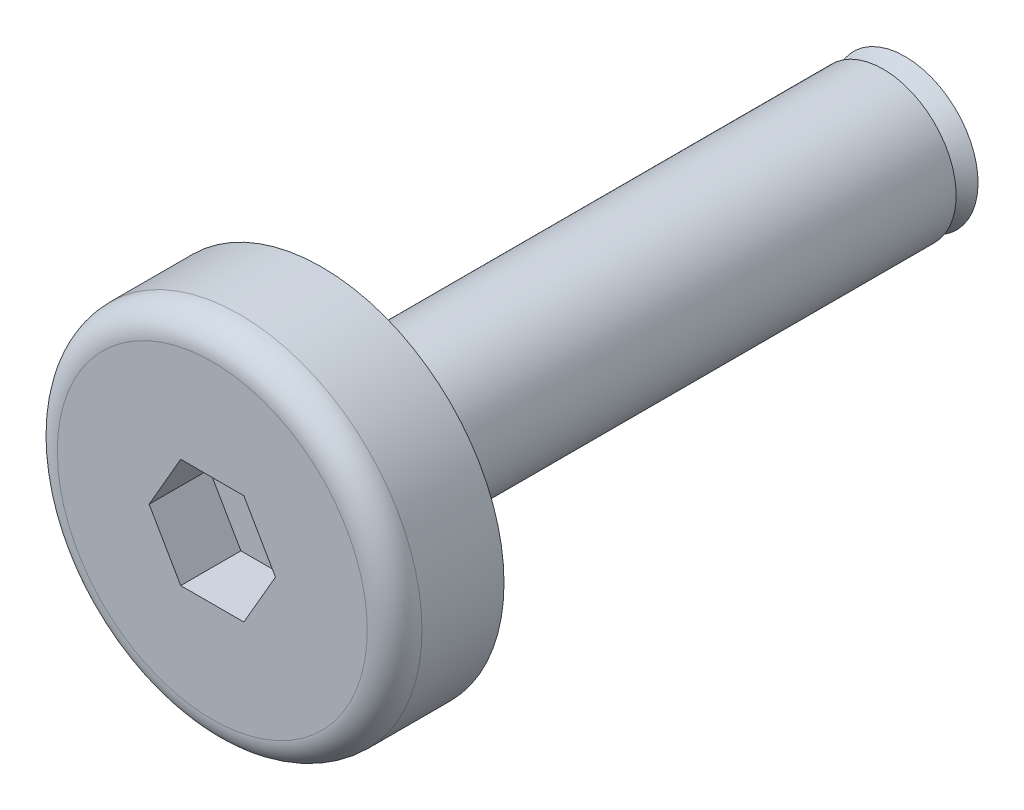
ISO-10303-21;
HEADER;
FILE_DESCRIPTION(('STEP AP214'),'2;1');
FILE_NAME('part.step','',(''),(''),'','','');
FILE_SCHEMA(('AUTOMOTIVE_DESIGN { 1 0 10303 214 1 1 1 1 }'));
ENDSEC;
DATA;
#1=APPLICATION_CONTEXT('core data for automotive mechanical design processes');
#2=APPLICATION_PROTOCOL_DEFINITION('international standard','automotive_design',2000,#1);
#3=PRODUCT_CONTEXT('',#1,'mechanical');
#4=PRODUCT('Part','Part','',(#3));
#5=PRODUCT_RELATED_PRODUCT_CATEGORY('part','',(#4));
#6=PRODUCT_DEFINITION_FORMATION('','',#4);
#7=PRODUCT_DEFINITION_CONTEXT('part definition',#1,'design');
#8=PRODUCT_DEFINITION('design','',#6,#7);
#9=PRODUCT_DEFINITION_SHAPE('','',#8);
#10=(LENGTH_UNIT() NAMED_UNIT(*) SI_UNIT(.MILLI.,.METRE.));
#11=(NAMED_UNIT(*) PLANE_ANGLE_UNIT() SI_UNIT($,.RADIAN.));
#12=(NAMED_UNIT(*) SI_UNIT($,.STERADIAN.) SOLID_ANGLE_UNIT());
#13=UNCERTAINTY_MEASURE_WITH_UNIT(LENGTH_MEASURE(1.E-05),#10,'distance_accuracy_value','');
#14=(GEOMETRIC_REPRESENTATION_CONTEXT(3) GLOBAL_UNCERTAINTY_ASSIGNED_CONTEXT((#13)) GLOBAL_UNIT_ASSIGNED_CONTEXT((#10,
#11,#12)) REPRESENTATION_CONTEXT('',''));
#15=CARTESIAN_POINT('',(0.,0.,0.));
#16=DIRECTION('',(0.,0.,1.));
#17=DIRECTION('',(1.,0.,0.));
#18=AXIS2_PLACEMENT_3D('',#15,#16,#17);
#19=CARTESIAN_POINT('',(0.,0.,1.5));
#20=DIRECTION('',(0.,0.,1.));
#21=DIRECTION('',(1.,0.,0.));
#22=AXIS2_PLACEMENT_3D('',#19,#20,#21);
#23=PLANE('',#22);
#24=CARTESIAN_POINT('',(0.,0.,1.5));
#25=DIRECTION('',(0.,0.,1.));
#26=DIRECTION('',(1.,0.,0.));
#27=AXIS2_PLACEMENT_3D('',#24,#25,#26);
#28=CIRCLE('',#27,2.125);
#29=CARTESIAN_POINT('',(2.125,0.,1.5));
#30=VERTEX_POINT('',#29);
#31=EDGE_CURVE('E142',#30,#30,#28,.T.);
#32=ORIENTED_EDGE('',*,*,#31,.T.);
#33=EDGE_LOOP('',(#32));
#34=FACE_BOUND('',#33,.T.);
#35=DIRECTION('',(0.5,-0.866025403784439,0.));
#36=VECTOR('',#35,1.);
#37=CARTESIAN_POINT('',(0.649519052838329,0.375,1.5));
#38=LINE('',#37,#36);
#39=CARTESIAN_POINT('',(0.433012701892219,0.75,1.5));
#40=VERTEX_POINT('',#39);
#41=CARTESIAN_POINT('',(0.866025403784439,0.,1.5));
#42=VERTEX_POINT('',#41);
#43=EDGE_CURVE('E51',#40,#42,#38,.T.);
#44=ORIENTED_EDGE('',*,*,#43,.T.);
#45=DIRECTION('',(-0.5,-0.866025403784439,0.));
#46=VECTOR('',#45,1.);
#47=CARTESIAN_POINT('',(0.649519052838329,-0.375,1.5));
#48=LINE('',#47,#46);
#49=CARTESIAN_POINT('',(0.433012701892219,-0.75,1.5));
#50=VERTEX_POINT('',#49);
#51=EDGE_CURVE('E11',#42,#50,#48,.T.);
#52=ORIENTED_EDGE('',*,*,#51,.T.);
#53=DIRECTION('',(-1.,0.,0.));
#54=VECTOR('',#53,1.);
#55=CARTESIAN_POINT('',(0.,-0.75,1.5));
#56=LINE('',#55,#54);
#57=CARTESIAN_POINT('',(-0.43301270189222,-0.75,1.5));
#58=VERTEX_POINT('',#57);
#59=EDGE_CURVE('E148',#50,#58,#56,.T.);
#60=ORIENTED_EDGE('',*,*,#59,.T.);
#61=DIRECTION('',(-0.5,0.866025403784439,0.));
#62=VECTOR('',#61,1.);
#63=CARTESIAN_POINT('',(-0.649519052838329,-0.375,1.5));
#64=LINE('',#63,#62);
#65=CARTESIAN_POINT('',(-0.866025403784439,0.,1.5));
#66=VERTEX_POINT('',#65);
#67=EDGE_CURVE('E151',#58,#66,#64,.T.);
#68=ORIENTED_EDGE('',*,*,#67,.T.);
#69=DIRECTION('',(0.5,0.866025403784438,0.));
#70=VECTOR('',#69,1.);
#71=CARTESIAN_POINT('',(-0.649519052838329,0.375,1.5));
#72=LINE('',#71,#70);
#73=CARTESIAN_POINT('',(-0.433012701892219,0.75,1.5));
#74=VERTEX_POINT('',#73);
#75=EDGE_CURVE('E154',#66,#74,#72,.T.);
#76=ORIENTED_EDGE('',*,*,#75,.T.);
#77=DIRECTION('',(1.,0.,0.));
#78=VECTOR('',#77,1.);
#79=CARTESIAN_POINT('',(0.,0.75,1.5));
#80=LINE('',#79,#78);
#81=EDGE_CURVE('E157',#74,#40,#80,.T.);
#82=ORIENTED_EDGE('',*,*,#81,.T.);
#83=EDGE_LOOP('',(#44,#52,#60,#68,#76,#82));
#84=FACE_BOUND('',#83,.T.);
#85=ADVANCED_FACE('F43',(#34,#84),#23,.T.);
#86=CARTESIAN_POINT('',(0.,0.,1.5));
#87=DIRECTION('',(0.,0.,-1.));
#88=DIRECTION('',(-1.,0.,0.));
#89=AXIS2_PLACEMENT_3D('',#86,#87,#88);
#90=CYLINDRICAL_SURFACE('',#89,2.5);
#91=CARTESIAN_POINT('',(0.,0.,1.125));
#92=DIRECTION('',(0.,0.,1.));
#93=DIRECTION('',(1.,0.,0.));
#94=AXIS2_PLACEMENT_3D('',#91,#92,#93);
#95=CIRCLE('',#94,2.5);
#96=CARTESIAN_POINT('',(2.5,0.,1.125));
#97=VERTEX_POINT('',#96);
#98=EDGE_CURVE('E145',#97,#97,#95,.F.);
#99=ORIENTED_EDGE('',*,*,#98,.T.);
#100=EDGE_LOOP('',(#99));
#101=FACE_BOUND('',#100,.T.);
#102=CARTESIAN_POINT('',(0.,0.,0.));
#103=DIRECTION('',(0.,0.,1.));
#104=DIRECTION('',(1.,0.,0.));
#105=AXIS2_PLACEMENT_3D('',#102,#103,#104);
#106=CIRCLE('',#105,2.5);
#107=CARTESIAN_POINT('',(2.5,0.,0.));
#108=VERTEX_POINT('',#107);
#109=EDGE_CURVE('E100',#108,#108,#106,.T.);
#110=ORIENTED_EDGE('',*,*,#109,.T.);
#111=EDGE_LOOP('',(#110));
#112=FACE_BOUND('',#111,.T.);
#113=ADVANCED_FACE('F181',(#101,#112),#90,.T.);
#114=CARTESIAN_POINT('',(0.,0.,0.));
#115=DIRECTION('',(0.,0.,1.));
#116=DIRECTION('',(1.,0.,0.));
#117=AXIS2_PLACEMENT_3D('',#114,#115,#116);
#118=PLANE('',#117);
#119=CARTESIAN_POINT('',(0.,0.,0.));
#120=DIRECTION('',(0.,0.,1.));
#121=DIRECTION('',(1.,0.,0.));
#122=AXIS2_PLACEMENT_3D('',#119,#120,#121);
#123=CIRCLE('',#122,1.);
#124=CARTESIAN_POINT('',(-1.,0.,0.));
#125=VERTEX_POINT('',#124);
#126=EDGE_CURVE('E119',#125,#125,#123,.T.);
#127=ORIENTED_EDGE('',*,*,#126,.T.);
#128=EDGE_LOOP('',(#127));
#129=FACE_BOUND('',#128,.T.);
#130=ORIENTED_EDGE('',*,*,#109,.F.);
#131=EDGE_LOOP('',(#130));
#132=FACE_BOUND('',#131,.T.);
#133=ADVANCED_FACE('F187',(#129,#132),#118,.F.);
#134=CARTESIAN_POINT('',(0.,0.,1.125));
#135=DIRECTION('',(0.,0.,1.));
#136=DIRECTION('',(1.,0.,0.));
#137=AXIS2_PLACEMENT_3D('',#134,#135,#136);
#138=TOROIDAL_SURFACE('',#137,2.125,0.375);
#139=ORIENTED_EDGE('',*,*,#98,.F.);
#140=EDGE_LOOP('',(#139));
#141=FACE_BOUND('',#140,.T.);
#142=ORIENTED_EDGE('',*,*,#31,.F.);
#143=EDGE_LOOP('',(#142));
#144=FACE_BOUND('',#143,.T.);
#145=ADVANCED_FACE('F45',(#141,#144),#138,.T.);
#146=CARTESIAN_POINT('',(0.433012701892219,-0.75,1.51));
#147=DIRECTION('',(-0.866025403784439,0.5,0.));
#148=DIRECTION('',(-0.5,-0.866025403784439,0.));
#149=AXIS2_PLACEMENT_3D('',#146,#147,#148);
#150=PLANE('',#149);
#151=DIRECTION('',(0.,0.,-1.));
#152=VECTOR('',#151,1.);
#153=CARTESIAN_POINT('',(0.866025403784439,0.,1.51));
#154=LINE('',#153,#152);
#155=CARTESIAN_POINT('',(0.866025403784439,0.,0.675));
#156=VERTEX_POINT('',#155);
#157=EDGE_CURVE('E93',#42,#156,#154,.T.);
#158=ORIENTED_EDGE('',*,*,#157,.T.);
#159=DIRECTION('',(0.5,0.866025403784439,0.));
#160=VECTOR('',#159,1.);
#161=CARTESIAN_POINT('',(0.433012701892219,-0.75,0.675));
#162=LINE('',#161,#160);
#163=CARTESIAN_POINT('',(0.433012701892219,-0.75,0.675));
#164=VERTEX_POINT('',#163);
#165=EDGE_CURVE('E97',#164,#156,#162,.T.);
#166=ORIENTED_EDGE('',*,*,#165,.F.);
#167=DIRECTION('',(0.,0.,-1.));
#168=VECTOR('',#167,1.);
#169=CARTESIAN_POINT('',(0.433012701892219,-0.75,1.51));
#170=LINE('',#169,#168);
#171=EDGE_CURVE('E132',#50,#164,#170,.T.);
#172=ORIENTED_EDGE('',*,*,#171,.F.);
#173=ORIENTED_EDGE('',*,*,#51,.F.);
#174=EDGE_LOOP('',(#158,#166,#172,#173));
#175=FACE_BOUND('',#174,.T.);
#176=ADVANCED_FACE('F95',(#175),#150,.T.);
#177=CARTESIAN_POINT('',(0.866025403784439,0.,1.51));
#178=DIRECTION('',(-0.866025403784439,-0.5,0.));
#179=DIRECTION('',(0.,0.,1.));
#180=AXIS2_PLACEMENT_3D('',#177,#178,#179);
#181=PLANE('',#180);
#182=DIRECTION('',(0.,0.,-1.));
#183=VECTOR('',#182,1.);
#184=CARTESIAN_POINT('',(0.433012701892219,0.75,1.51));
#185=LINE('',#184,#183);
#186=CARTESIAN_POINT('',(0.433012701892219,0.75,0.675));
#187=VERTEX_POINT('',#186);
#188=EDGE_CURVE('E101',#40,#187,#185,.T.);
#189=ORIENTED_EDGE('',*,*,#188,.T.);
#190=DIRECTION('',(-0.5,0.866025403784439,0.));
#191=VECTOR('',#190,1.);
#192=CARTESIAN_POINT('',(0.866025403784439,0.,0.675));
#193=LINE('',#192,#191);
#194=EDGE_CURVE('E104',#156,#187,#193,.T.);
#195=ORIENTED_EDGE('',*,*,#194,.F.);
#196=ORIENTED_EDGE('',*,*,#157,.F.);
#197=ORIENTED_EDGE('',*,*,#43,.F.);
#198=EDGE_LOOP('',(#189,#195,#196,#197));
#199=FACE_BOUND('',#198,.T.);
#200=ADVANCED_FACE('F105',(#199),#181,.T.);
#201=CARTESIAN_POINT('',(0.433012701892219,0.75,1.51));
#202=DIRECTION('',(0.,-1.,0.));
#203=DIRECTION('',(1.,0.,0.));
#204=AXIS2_PLACEMENT_3D('',#201,#202,#203);
#205=PLANE('',#204);
#206=DIRECTION('',(0.,0.,-1.));
#207=VECTOR('',#206,1.);
#208=CARTESIAN_POINT('',(-0.433012701892219,0.75,1.51));
#209=LINE('',#208,#207);
#210=CARTESIAN_POINT('',(-0.433012701892219,0.75,0.675));
#211=VERTEX_POINT('',#210);
#212=EDGE_CURVE('E137',#74,#211,#209,.T.);
#213=ORIENTED_EDGE('',*,*,#212,.T.);
#214=DIRECTION('',(-1.,0.,0.));
#215=VECTOR('',#214,1.);
#216=CARTESIAN_POINT('',(0.433012701892219,0.75,0.675));
#217=LINE('',#216,#215);
#218=EDGE_CURVE('E110',#187,#211,#217,.T.);
#219=ORIENTED_EDGE('',*,*,#218,.F.);
#220=ORIENTED_EDGE('',*,*,#188,.F.);
#221=ORIENTED_EDGE('',*,*,#81,.F.);
#222=EDGE_LOOP('',(#213,#219,#220,#221));
#223=FACE_BOUND('',#222,.T.);
#224=ADVANCED_FACE('F161',(#223),#205,.T.);
#225=CARTESIAN_POINT('',(-0.433012701892219,0.75,1.51));
#226=DIRECTION('',(0.866025403784439,-0.5,0.));
#227=DIRECTION('',(0.500000000000001,0.866025403784439,0.));
#228=AXIS2_PLACEMENT_3D('',#225,#226,#227);
#229=PLANE('',#228);
#230=DIRECTION('',(0.,0.,-1.));
#231=VECTOR('',#230,1.);
#232=CARTESIAN_POINT('',(-0.866025403784439,0.,1.51));
#233=LINE('',#232,#231);
#234=CARTESIAN_POINT('',(-0.866025403784439,0.,0.675));
#235=VERTEX_POINT('',#234);
#236=EDGE_CURVE('E135',#66,#235,#233,.T.);
#237=ORIENTED_EDGE('',*,*,#236,.T.);
#238=DIRECTION('',(-0.5,-0.866025403784439,0.));
#239=VECTOR('',#238,1.);
#240=CARTESIAN_POINT('',(-0.433012701892219,0.75,0.675));
#241=LINE('',#240,#239);
#242=EDGE_CURVE('E126',#211,#235,#241,.T.);
#243=ORIENTED_EDGE('',*,*,#242,.F.);
#244=ORIENTED_EDGE('',*,*,#212,.F.);
#245=ORIENTED_EDGE('',*,*,#75,.F.);
#246=EDGE_LOOP('',(#237,#243,#244,#245));
#247=FACE_BOUND('',#246,.T.);
#248=ADVANCED_FACE('F166',(#247),#229,.T.);
#249=CARTESIAN_POINT('',(-0.866025403784439,0.,1.51));
#250=DIRECTION('',(0.866025403784439,0.5,0.));
#251=DIRECTION('',(0.,0.,-1.));
#252=AXIS2_PLACEMENT_3D('',#249,#250,#251);
#253=PLANE('',#252);
#254=DIRECTION('',(0.,0.,-1.));
#255=VECTOR('',#254,1.);
#256=CARTESIAN_POINT('',(-0.43301270189222,-0.75,1.51));
#257=LINE('',#256,#255);
#258=CARTESIAN_POINT('',(-0.43301270189222,-0.75,0.675));
#259=VERTEX_POINT('',#258);
#260=EDGE_CURVE('E58',#58,#259,#257,.T.);
#261=ORIENTED_EDGE('',*,*,#260,.T.);
#262=DIRECTION('',(0.5,-0.866025403784439,0.));
#263=VECTOR('',#262,1.);
#264=CARTESIAN_POINT('',(-0.866025403784439,0.,0.675));
#265=LINE('',#264,#263);
#266=EDGE_CURVE('E129',#235,#259,#265,.T.);
#267=ORIENTED_EDGE('',*,*,#266,.F.);
#268=ORIENTED_EDGE('',*,*,#236,.F.);
#269=ORIENTED_EDGE('',*,*,#67,.F.);
#270=EDGE_LOOP('',(#261,#267,#268,#269));
#271=FACE_BOUND('',#270,.T.);
#272=ADVANCED_FACE('F169',(#271),#253,.T.);
#273=CARTESIAN_POINT('',(-0.43301270189222,-0.75,1.51));
#274=DIRECTION('',(0.,1.,0.));
#275=DIRECTION('',(-1.,0.,0.));
#276=AXIS2_PLACEMENT_3D('',#273,#274,#275);
#277=PLANE('',#276);
#278=ORIENTED_EDGE('',*,*,#171,.T.);
#279=DIRECTION('',(1.,0.,0.));
#280=VECTOR('',#279,1.);
#281=CARTESIAN_POINT('',(-0.43301270189222,-0.75,0.675));
#282=LINE('',#281,#280);
#283=EDGE_CURVE('E115',#259,#164,#282,.T.);
#284=ORIENTED_EDGE('',*,*,#283,.F.);
#285=ORIENTED_EDGE('',*,*,#260,.F.);
#286=ORIENTED_EDGE('',*,*,#59,.F.);
#287=EDGE_LOOP('',(#278,#284,#285,#286));
#288=FACE_BOUND('',#287,.T.);
#289=ADVANCED_FACE('F170',(#288),#277,.T.);
#290=CARTESIAN_POINT('',(0.866025403784439,0.,0.675));
#291=DIRECTION('',(0.,0.,1.));
#292=DIRECTION('',(-0.5,0.866025403784439,0.));
#293=AXIS2_PLACEMENT_3D('',#290,#291,#292);
#294=PLANE('',#293);
#295=ORIENTED_EDGE('',*,*,#165,.T.);
#296=ORIENTED_EDGE('',*,*,#194,.T.);
#297=ORIENTED_EDGE('',*,*,#218,.T.);
#298=ORIENTED_EDGE('',*,*,#242,.T.);
#299=ORIENTED_EDGE('',*,*,#266,.T.);
#300=ORIENTED_EDGE('',*,*,#283,.T.);
#301=EDGE_LOOP('',(#295,#296,#297,#298,#299,#300));
#302=FACE_BOUND('',#301,.T.);
#303=ADVANCED_FACE('F113',(#302),#294,.T.);
#304=CARTESIAN_POINT('',(0.,0.,0.));
#305=DIRECTION('',(0.,0.,-1.));
#306=DIRECTION('',(-1.,0.,0.));
#307=AXIS2_PLACEMENT_3D('',#304,#305,#306);
#308=CYLINDRICAL_SURFACE('',#307,1.);
#309=CARTESIAN_POINT('',(0.,0.,-7.7));
#310=DIRECTION('',(0.,0.,1.));
#311=DIRECTION('',(1.,0.,0.));
#312=AXIS2_PLACEMENT_3D('',#309,#310,#311);
#313=CIRCLE('',#312,1.);
#314=CARTESIAN_POINT('',(-1.,0.,-7.7));
#315=VERTEX_POINT('',#314);
#316=EDGE_CURVE('E122',#315,#315,#313,.T.);
#317=CARTESIAN_POINT('',(-1.,0.,0.));
#318=CARTESIAN_POINT('',(-1.,0.,-0.0802083333333335));
#319=CARTESIAN_POINT('',(-1.,0.,-0.160416666666667));
#320=CARTESIAN_POINT('',(-1.,0.,-0.320833333333333));
#321=CARTESIAN_POINT('',(-1.,0.,-0.401041666666667));
#322=CARTESIAN_POINT('',(-1.,0.,-0.561458333333333));
#323=CARTESIAN_POINT('',(-1.,0.,-0.641666666666667));
#324=CARTESIAN_POINT('',(-1.,0.,-0.802083333333333));
#325=CARTESIAN_POINT('',(-1.,0.,-0.882291666666667));
#326=CARTESIAN_POINT('',(-1.,0.,-1.04270833333333));
#327=CARTESIAN_POINT('',(-1.,0.,-1.12291666666667));
#328=CARTESIAN_POINT('',(-1.,0.,-1.28333333333333));
#329=CARTESIAN_POINT('',(-1.,0.,-1.36354166666667));
#330=CARTESIAN_POINT('',(-1.,0.,-1.52395833333333));
#331=CARTESIAN_POINT('',(-1.,0.,-1.60416666666667));
#332=CARTESIAN_POINT('',(-1.,0.,-1.76458333333333));
#333=CARTESIAN_POINT('',(-1.,0.,-1.84479166666667));
#334=CARTESIAN_POINT('',(-1.,0.,-2.00520833333333));
#335=CARTESIAN_POINT('',(-1.,0.,-2.08541666666667));
#336=CARTESIAN_POINT('',(-1.,0.,-2.24583333333333));
#337=CARTESIAN_POINT('',(-1.,0.,-2.32604166666667));
#338=CARTESIAN_POINT('',(-1.,0.,-2.48645833333333));
#339=CARTESIAN_POINT('',(-1.,0.,-2.56666666666667));
#340=CARTESIAN_POINT('',(-1.,0.,-2.72708333333333));
#341=CARTESIAN_POINT('',(-1.,0.,-2.80729166666667));
#342=CARTESIAN_POINT('',(-1.,0.,-2.96770833333333));
#343=CARTESIAN_POINT('',(-1.,0.,-3.04791666666667));
#344=CARTESIAN_POINT('',(-1.,0.,-3.20833333333333));
#345=CARTESIAN_POINT('',(-1.,0.,-3.28854166666667));
#346=CARTESIAN_POINT('',(-1.,0.,-3.44895833333333));
#347=CARTESIAN_POINT('',(-1.,0.,-3.52916666666667));
#348=CARTESIAN_POINT('',(-1.,0.,-3.68958333333333));
#349=CARTESIAN_POINT('',(-1.,0.,-3.76979166666667));
#350=CARTESIAN_POINT('',(-1.,0.,-3.93020833333333));
#351=CARTESIAN_POINT('',(-1.,0.,-4.01041666666667));
#352=CARTESIAN_POINT('',(-1.,0.,-4.17083333333333));
#353=CARTESIAN_POINT('',(-1.,0.,-4.25104166666667));
#354=CARTESIAN_POINT('',(-1.,0.,-4.41145833333333));
#355=CARTESIAN_POINT('',(-1.,0.,-4.49166666666667));
#356=CARTESIAN_POINT('',(-1.,0.,-4.65208333333333));
#357=CARTESIAN_POINT('',(-1.,0.,-4.73229166666667));
#358=CARTESIAN_POINT('',(-1.,0.,-4.89270833333333));
#359=CARTESIAN_POINT('',(-1.,0.,-4.97291666666667));
#360=CARTESIAN_POINT('',(-1.,0.,-5.13333333333333));
#361=CARTESIAN_POINT('',(-1.,0.,-5.21354166666667));
#362=CARTESIAN_POINT('',(-1.,0.,-5.37395833333333));
#363=CARTESIAN_POINT('',(-1.,0.,-5.45416666666667));
#364=CARTESIAN_POINT('',(-1.,0.,-5.61458333333333));
#365=CARTESIAN_POINT('',(-1.,0.,-5.69479166666667));
#366=CARTESIAN_POINT('',(-1.,0.,-5.85520833333333));
#367=CARTESIAN_POINT('',(-1.,0.,-5.93541666666667));
#368=CARTESIAN_POINT('',(-1.,0.,-6.09583333333333));
#369=CARTESIAN_POINT('',(-1.,0.,-6.17604166666667));
#370=CARTESIAN_POINT('',(-1.,0.,-6.33645833333333));
#371=CARTESIAN_POINT('',(-1.,0.,-6.41666666666667));
#372=CARTESIAN_POINT('',(-1.,0.,-6.57708333333333));
#373=CARTESIAN_POINT('',(-1.,0.,-6.65729166666667));
#374=CARTESIAN_POINT('',(-1.,0.,-6.81770833333333));
#375=CARTESIAN_POINT('',(-1.,0.,-6.89791666666667));
#376=CARTESIAN_POINT('',(-1.,0.,-7.05833333333333));
#377=CARTESIAN_POINT('',(-1.,0.,-7.13854166666667));
#378=CARTESIAN_POINT('',(-1.,0.,-7.29895833333333));
#379=CARTESIAN_POINT('',(-1.,0.,-7.37916666666667));
#380=CARTESIAN_POINT('',(-1.,0.,-7.53958333333333));
#381=CARTESIAN_POINT('',(-1.,0.,-7.61979166666667));
#382=CARTESIAN_POINT('',(-1.,0.,-7.7));
#383=B_SPLINE_CURVE_WITH_KNOTS('',3,(#317,#318,#319,#320,#321,#322,#323,#324,#325,#326,#327,
#328,#329,#330,#331,#332,#333,#334,#335,#336,#337,#338,#339,#340,#341,#342,#343,#344,#345,#346,
#347,#348,#349,#350,#351,#352,#353,#354,#355,#356,#357,#358,#359,#360,#361,#362,#363,#364,#365,
#366,#367,#368,#369,#370,#371,#372,#373,#374,#375,#376,#377,#378,#379,#380,#381,#382),
.UNSPECIFIED.,.F.,.F.,(4,2,2,2,2,2,2,2,2,2,2,2,2,2,2,2,2,2,2,2,2,2,2,2,2,2,2,2,2,2,2,2,4),(0.,
0.240625,0.48125,0.721875,0.9625,1.203125,1.44375,1.684375,1.925,2.165625,2.40625,2.646875,
2.8875,3.128125,3.36875,3.609375,3.85,4.090625,4.33125,4.571875,4.8125,5.053125,5.29375,
5.534375,5.775,6.015625,6.25625,6.496875,6.7375,6.978125,7.21875,7.459375,7.7),.UNSPECIFIED.);
#384=EDGE_CURVE('BSEAM177',#125,#315,#383,.T.);
#385=ORIENTED_EDGE('',*,*,#126,.F.);
#386=ORIENTED_EDGE('',*,*,#316,.T.);
#387=ORIENTED_EDGE('',*,*,#384,.T.);
#388=ORIENTED_EDGE('',*,*,#384,.F.);
#389=EDGE_LOOP('',(#385,#387,#386,#388));
#390=FACE_BOUND('',#389,.T.);
#391=ADVANCED_FACE('F177',(#390),#308,.T.);
#392=CARTESIAN_POINT('',(0.,0.,-7.7));
#393=DIRECTION('',(0.,0.,1.));
#394=DIRECTION('',(1.,0.,0.));
#395=AXIS2_PLACEMENT_3D('',#392,#393,#394);
#396=PLANE('',#395);
#397=CARTESIAN_POINT('',(0.,0.,-7.70000000000001));
#398=DIRECTION('',(0.,0.,-1.));
#399=DIRECTION('',(0.,1.,0.));
#400=AXIS2_PLACEMENT_3D('',#397,#398,#399);
#401=CIRCLE('',#400,0.7);
#402=CARTESIAN_POINT('',(0.,0.7,-7.70000000000001));
#403=VERTEX_POINT('',#402);
#404=EDGE_CURVE('E116',#403,#403,#401,.T.);
#405=ORIENTED_EDGE('',*,*,#404,.F.);
#406=EDGE_LOOP('',(#405));
#407=FACE_BOUND('',#406,.T.);
#408=ORIENTED_EDGE('',*,*,#316,.F.);
#409=EDGE_LOOP('',(#408));
#410=FACE_BOUND('',#409,.T.);
#411=ADVANCED_FACE('F219',(#407,#410),#396,.F.);
#412=CARTESIAN_POINT('',(0.,0.,-8.));
#413=DIRECTION('',(0.,0.,-1.));
#414=DIRECTION('',(0.,1.,0.));
#415=AXIS2_PLACEMENT_3D('',#412,#413,#414);
#416=PLANE('',#415);
#417=CARTESIAN_POINT('',(0.,0.,-8.));
#418=DIRECTION('',(0.,0.,-1.));
#419=DIRECTION('',(0.,1.,0.));
#420=AXIS2_PLACEMENT_3D('',#417,#418,#419);
#421=CIRCLE('',#420,1.);
#422=CARTESIAN_POINT('',(0.,1.,-8.));
#423=VERTEX_POINT('',#422);
#424=EDGE_CURVE('E205',#423,#423,#421,.T.);
#425=ORIENTED_EDGE('',*,*,#424,.T.);
#426=EDGE_LOOP('',(#425));
#427=FACE_BOUND('',#426,.T.);
#428=ADVANCED_FACE('F210',(#427),#416,.T.);
#429=CARTESIAN_POINT('',(0.,0.,-8.));
#430=DIRECTION('',(0.,0.,-1.));
#431=DIRECTION('',(0.,1.,0.));
#432=AXIS2_PLACEMENT_3D('',#429,#430,#431);
#433=CONICAL_SURFACE('',#432,1.,0.785398163397457);
#434=ORIENTED_EDGE('',*,*,#404,.T.);
#435=EDGE_LOOP('',(#434));
#436=FACE_BOUND('',#435,.T.);
#437=ORIENTED_EDGE('',*,*,#424,.F.);
#438=EDGE_LOOP('',(#437));
#439=FACE_BOUND('',#438,.T.);
#440=ADVANCED_FACE('F212',(#436,#439),#433,.T.);
#441=CLOSED_SHELL('',(#85,#113,#133,#145,#176,#200,#224,#248,#272,#289,#303,#391,#411,#428,#440));
#442=MANIFOLD_SOLID_BREP('B2',#441);
#443=ADVANCED_BREP_SHAPE_REPRESENTATION('',(#18,#442),#14);
#444=SHAPE_DEFINITION_REPRESENTATION(#9,#443);
ENDSEC;
END-ISO-10303-21;
